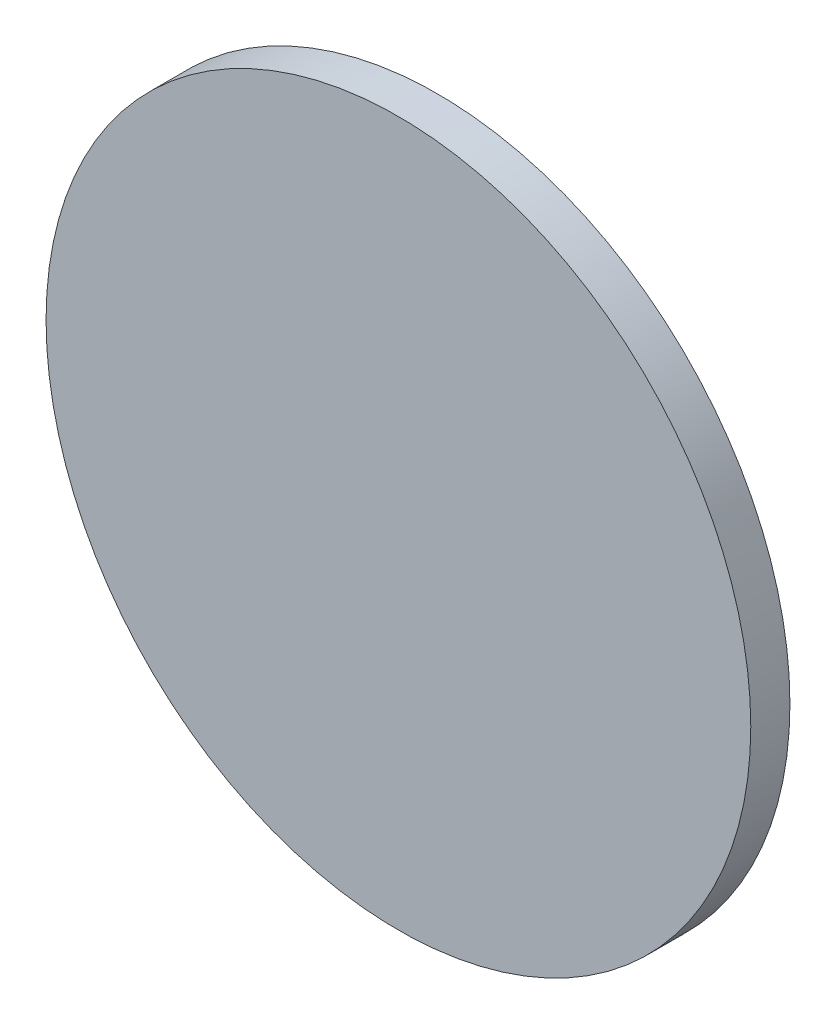
ISO-10303-21;
HEADER;
FILE_DESCRIPTION(('STEP AP214'),'2;1');
FILE_NAME('part.step','',(''),(''),'','','');
FILE_SCHEMA(('AUTOMOTIVE_DESIGN { 1 0 10303 214 1 1 1 1 }'));
ENDSEC;
DATA;
#1=APPLICATION_CONTEXT('core data for automotive mechanical design processes');
#2=APPLICATION_PROTOCOL_DEFINITION('international standard','automotive_design',2000,#1);
#3=PRODUCT_CONTEXT('',#1,'mechanical');
#4=PRODUCT('Part','Part','',(#3));
#5=PRODUCT_RELATED_PRODUCT_CATEGORY('part','',(#4));
#6=PRODUCT_DEFINITION_FORMATION('','',#4);
#7=PRODUCT_DEFINITION_CONTEXT('part definition',#1,'design');
#8=PRODUCT_DEFINITION('design','',#6,#7);
#9=PRODUCT_DEFINITION_SHAPE('','',#8);
#10=(LENGTH_UNIT() NAMED_UNIT(*) SI_UNIT(.MILLI.,.METRE.));
#11=(NAMED_UNIT(*) PLANE_ANGLE_UNIT() SI_UNIT($,.RADIAN.));
#12=(NAMED_UNIT(*) SI_UNIT($,.STERADIAN.) SOLID_ANGLE_UNIT());
#13=UNCERTAINTY_MEASURE_WITH_UNIT(LENGTH_MEASURE(1.E-05),#10,'distance_accuracy_value','');
#14=(GEOMETRIC_REPRESENTATION_CONTEXT(3) GLOBAL_UNCERTAINTY_ASSIGNED_CONTEXT((#13)) GLOBAL_UNIT_ASSIGNED_CONTEXT((#10,
#11,#12)) REPRESENTATION_CONTEXT('',''));
#15=CARTESIAN_POINT('',(0.,0.,0.));
#16=DIRECTION('',(0.,0.,1.));
#17=DIRECTION('',(1.,0.,0.));
#18=AXIS2_PLACEMENT_3D('',#15,#16,#17);
#19=CARTESIAN_POINT('',(0.,0.,12.7));
#20=DIRECTION('',(0.,0.,-1.));
#21=DIRECTION('',(-1.,0.,0.));
#22=AXIS2_PLACEMENT_3D('',#19,#20,#21);
#23=CYLINDRICAL_SURFACE('',#22,114.3);
#24=CARTESIAN_POINT('',(0.,0.,12.7));
#25=DIRECTION('',(0.,0.,1.));
#26=DIRECTION('',(1.,0.,0.));
#27=AXIS2_PLACEMENT_3D('',#24,#25,#26);
#28=CIRCLE('',#27,114.3);
#29=CARTESIAN_POINT('',(114.3,0.,12.7));
#30=VERTEX_POINT('',#29);
#31=EDGE_CURVE('E10',#30,#30,#28,.T.);
#32=ORIENTED_EDGE('',*,*,#31,.F.);
#33=EDGE_LOOP('',(#32));
#34=FACE_BOUND('',#33,.T.);
#35=CARTESIAN_POINT('',(0.,0.,0.));
#36=DIRECTION('',(0.,0.,1.));
#37=DIRECTION('',(1.,0.,0.));
#38=AXIS2_PLACEMENT_3D('',#35,#36,#37);
#39=CIRCLE('',#38,114.3);
#40=CARTESIAN_POINT('',(114.3,0.,0.));
#41=VERTEX_POINT('',#40);
#42=EDGE_CURVE('E36',#41,#41,#39,.T.);
#43=ORIENTED_EDGE('',*,*,#42,.T.);
#44=EDGE_LOOP('',(#43));
#45=FACE_BOUND('',#44,.T.);
#46=ADVANCED_FACE('F30',(#34,#45),#23,.T.);
#47=CARTESIAN_POINT('',(0.,0.,12.7));
#48=DIRECTION('',(0.,0.,1.));
#49=DIRECTION('',(1.,0.,0.));
#50=AXIS2_PLACEMENT_3D('',#47,#48,#49);
#51=PLANE('',#50);
#52=ORIENTED_EDGE('',*,*,#31,.T.);
#53=EDGE_LOOP('',(#52));
#54=FACE_BOUND('',#53,.T.);
#55=ADVANCED_FACE('F45',(#54),#51,.T.);
#56=CARTESIAN_POINT('',(0.,0.,0.));
#57=DIRECTION('',(0.,0.,1.));
#58=DIRECTION('',(1.,0.,0.));
#59=AXIS2_PLACEMENT_3D('',#56,#57,#58);
#60=PLANE('',#59);
#61=ORIENTED_EDGE('',*,*,#42,.F.);
#62=EDGE_LOOP('',(#61));
#63=FACE_BOUND('',#62,.T.);
#64=ADVANCED_FACE('F43',(#63),#60,.F.);
#65=CLOSED_SHELL('',(#46,#55,#64));
#66=MANIFOLD_SOLID_BREP('B2',#65);
#67=ADVANCED_BREP_SHAPE_REPRESENTATION('',(#18,#66),#14);
#68=SHAPE_DEFINITION_REPRESENTATION(#9,#67);
ENDSEC;
END-ISO-10303-21;
